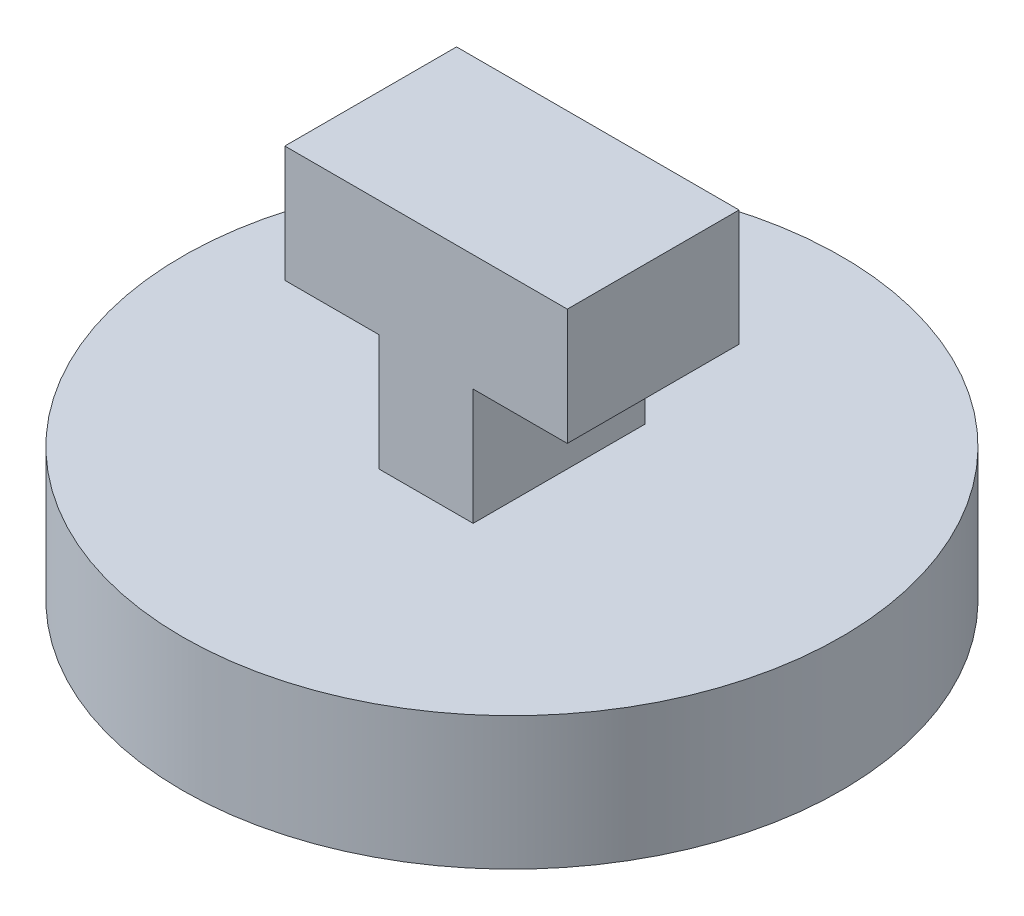
ISO-10303-21;
HEADER;
FILE_DESCRIPTION(('STEP AP214'),'2;1');
FILE_NAME('part.step','',(''),(''),'','','');
FILE_SCHEMA(('AUTOMOTIVE_DESIGN { 1 0 10303 214 1 1 1 1 }'));
ENDSEC;
DATA;
#1=APPLICATION_CONTEXT('core data for automotive mechanical design processes');
#2=APPLICATION_PROTOCOL_DEFINITION('international standard','automotive_design',2000,#1);
#3=PRODUCT_CONTEXT('',#1,'mechanical');
#4=PRODUCT('Part','Part','',(#3));
#5=PRODUCT_RELATED_PRODUCT_CATEGORY('part','',(#4));
#6=PRODUCT_DEFINITION_FORMATION('','',#4);
#7=PRODUCT_DEFINITION_CONTEXT('part definition',#1,'design');
#8=PRODUCT_DEFINITION('design','',#6,#7);
#9=PRODUCT_DEFINITION_SHAPE('','',#8);
#10=(LENGTH_UNIT() NAMED_UNIT(*) SI_UNIT(.MILLI.,.METRE.));
#11=(NAMED_UNIT(*) PLANE_ANGLE_UNIT() SI_UNIT($,.RADIAN.));
#12=(NAMED_UNIT(*) SI_UNIT($,.STERADIAN.) SOLID_ANGLE_UNIT());
#13=UNCERTAINTY_MEASURE_WITH_UNIT(LENGTH_MEASURE(1.E-05),#10,'distance_accuracy_value','');
#14=(GEOMETRIC_REPRESENTATION_CONTEXT(3) GLOBAL_UNCERTAINTY_ASSIGNED_CONTEXT((#13)) GLOBAL_UNIT_ASSIGNED_CONTEXT((#10,
#11,#12)) REPRESENTATION_CONTEXT('',''));
#15=CARTESIAN_POINT('',(0.,0.,0.));
#16=DIRECTION('',(0.,0.,1.));
#17=DIRECTION('',(1.,0.,0.));
#18=AXIS2_PLACEMENT_3D('',#15,#16,#17);
#19=CARTESIAN_POINT('',(0.,2.4,0.));
#20=DIRECTION('',(0.,1.,0.));
#21=DIRECTION('',(0.,0.,1.));
#22=AXIS2_PLACEMENT_3D('',#19,#20,#21);
#23=PLANE('',#22);
#24=CARTESIAN_POINT('',(0.,2.4,0.));
#25=DIRECTION('',(0.,1.,0.));
#26=DIRECTION('',(0.,0.,1.));
#27=AXIS2_PLACEMENT_3D('',#24,#25,#26);
#28=CIRCLE('',#27,5.95);
#29=CARTESIAN_POINT('',(0.,2.4,5.95));
#30=VERTEX_POINT('',#29);
#31=EDGE_CURVE('E11',#30,#30,#28,.T.);
#32=ORIENTED_EDGE('',*,*,#31,.T.);
#33=EDGE_LOOP('',(#32));
#34=FACE_BOUND('',#33,.T.);
#35=DIRECTION('',(1.,0.,0.));
#36=VECTOR('',#35,1.);
#37=CARTESIAN_POINT('',(-0.849999999999999,2.4,-1.55));
#38=LINE('',#37,#36);
#39=CARTESIAN_POINT('',(-0.849999999999999,2.4,-1.55));
#40=VERTEX_POINT('',#39);
#41=CARTESIAN_POINT('',(0.850000000000004,2.4,-1.55));
#42=VERTEX_POINT('',#41);
#43=EDGE_CURVE('E70',#40,#42,#38,.T.);
#44=ORIENTED_EDGE('',*,*,#43,.T.);
#45=DIRECTION('',(0.,0.,1.));
#46=VECTOR('',#45,1.);
#47=CARTESIAN_POINT('',(0.850000000000004,2.4,-1.55));
#48=LINE('',#47,#46);
#49=CARTESIAN_POINT('',(0.850000000000004,2.4,1.55));
#50=VERTEX_POINT('',#49);
#51=EDGE_CURVE('E119',#42,#50,#48,.T.);
#52=ORIENTED_EDGE('',*,*,#51,.T.);
#53=DIRECTION('',(1.,0.,0.));
#54=VECTOR('',#53,1.);
#55=CARTESIAN_POINT('',(-0.849999999999999,2.4,1.55));
#56=LINE('',#55,#54);
#57=CARTESIAN_POINT('',(-0.849999999999999,2.4,1.55));
#58=VERTEX_POINT('',#57);
#59=EDGE_CURVE('E126',#58,#50,#56,.T.);
#60=ORIENTED_EDGE('',*,*,#59,.F.);
#61=DIRECTION('',(0.,0.,1.));
#62=VECTOR('',#61,1.);
#63=CARTESIAN_POINT('',(-0.849999999999999,2.4,-1.55));
#64=LINE('',#63,#62);
#65=EDGE_CURVE('E163',#40,#58,#64,.T.);
#66=ORIENTED_EDGE('',*,*,#65,.F.);
#67=EDGE_LOOP('',(#44,#52,#60,#66));
#68=FACE_BOUND('',#67,.T.);
#69=ADVANCED_FACE('F49',(#34,#68),#23,.T.);
#70=CARTESIAN_POINT('',(0.,2.4,0.));
#71=DIRECTION('',(0.,-1.,0.));
#72=DIRECTION('',(0.,0.,-1.));
#73=AXIS2_PLACEMENT_3D('',#70,#71,#72);
#74=CYLINDRICAL_SURFACE('',#73,5.95);
#75=ORIENTED_EDGE('',*,*,#31,.F.);
#76=EDGE_LOOP('',(#75));
#77=FACE_BOUND('',#76,.T.);
#78=CARTESIAN_POINT('',(0.,0.,0.));
#79=DIRECTION('',(0.,1.,0.));
#80=DIRECTION('',(0.,0.,1.));
#81=AXIS2_PLACEMENT_3D('',#78,#79,#80);
#82=CIRCLE('',#81,5.95);
#83=CARTESIAN_POINT('',(0.,0.,5.95));
#84=VERTEX_POINT('',#83);
#85=EDGE_CURVE('E53',#84,#84,#82,.T.);
#86=ORIENTED_EDGE('',*,*,#85,.T.);
#87=EDGE_LOOP('',(#86));
#88=FACE_BOUND('',#87,.T.);
#89=ADVANCED_FACE('F51',(#77,#88),#74,.T.);
#90=CARTESIAN_POINT('',(0.,0.,0.));
#91=DIRECTION('',(0.,1.,0.));
#92=DIRECTION('',(0.,0.,1.));
#93=AXIS2_PLACEMENT_3D('',#90,#91,#92);
#94=PLANE('',#93);
#95=ORIENTED_EDGE('',*,*,#85,.F.);
#96=EDGE_LOOP('',(#95));
#97=FACE_BOUND('',#96,.T.);
#98=ADVANCED_FACE('F229',(#97),#94,.F.);
#99=CARTESIAN_POINT('',(-0.849999999999999,2.4,-1.55));
#100=DIRECTION('',(-1.,0.,0.));
#101=DIRECTION('',(0.,0.,1.));
#102=AXIS2_PLACEMENT_3D('',#99,#100,#101);
#103=PLANE('',#102);
#104=ORIENTED_EDGE('',*,*,#65,.T.);
#105=DIRECTION('',(0.,-1.,0.));
#106=VECTOR('',#105,1.);
#107=CARTESIAN_POINT('',(-0.849999999999999,2.4,1.55));
#108=LINE('',#107,#106);
#109=CARTESIAN_POINT('',(-0.849999999999999,4.5,1.55));
#110=VERTEX_POINT('',#109);
#111=EDGE_CURVE('E133',#110,#58,#108,.T.);
#112=ORIENTED_EDGE('',*,*,#111,.F.);
#113=DIRECTION('',(0.,0.,1.));
#114=VECTOR('',#113,1.);
#115=CARTESIAN_POINT('',(-0.849999999999999,4.5,-1.55));
#116=LINE('',#115,#114);
#117=CARTESIAN_POINT('',(-0.849999999999999,4.5,-1.55));
#118=VERTEX_POINT('',#117);
#119=EDGE_CURVE('E160',#118,#110,#116,.T.);
#120=ORIENTED_EDGE('',*,*,#119,.F.);
#121=DIRECTION('',(0.,-1.,0.));
#122=VECTOR('',#121,1.);
#123=CARTESIAN_POINT('',(-0.849999999999999,2.4,-1.55));
#124=LINE('',#123,#122);
#125=EDGE_CURVE('E139',#118,#40,#124,.T.);
#126=ORIENTED_EDGE('',*,*,#125,.T.);
#127=EDGE_LOOP('',(#104,#112,#120,#126));
#128=FACE_BOUND('',#127,.T.);
#129=ADVANCED_FACE('F227',(#128),#103,.T.);
#130=CARTESIAN_POINT('',(-0.849999999999999,4.5,-1.55));
#131=DIRECTION('',(0.,-1.,0.));
#132=DIRECTION('',(0.,0.,-1.));
#133=AXIS2_PLACEMENT_3D('',#130,#131,#132);
#134=PLANE('',#133);
#135=ORIENTED_EDGE('',*,*,#119,.T.);
#136=DIRECTION('',(1.,0.,0.));
#137=VECTOR('',#136,1.);
#138=CARTESIAN_POINT('',(-0.849999999999999,4.5,1.55));
#139=LINE('',#138,#137);
#140=CARTESIAN_POINT('',(-2.55,4.5,1.55));
#141=VERTEX_POINT('',#140);
#142=EDGE_CURVE('E191',#141,#110,#139,.T.);
#143=ORIENTED_EDGE('',*,*,#142,.F.);
#144=DIRECTION('',(0.,0.,1.));
#145=VECTOR('',#144,1.);
#146=CARTESIAN_POINT('',(-2.55,4.5,-1.55));
#147=LINE('',#146,#145);
#148=CARTESIAN_POINT('',(-2.55,4.5,-1.55));
#149=VERTEX_POINT('',#148);
#150=EDGE_CURVE('E157',#149,#141,#147,.T.);
#151=ORIENTED_EDGE('',*,*,#150,.F.);
#152=DIRECTION('',(1.,0.,0.));
#153=VECTOR('',#152,1.);
#154=CARTESIAN_POINT('',(-0.849999999999999,4.5,-1.55));
#155=LINE('',#154,#153);
#156=EDGE_CURVE('E146',#149,#118,#155,.T.);
#157=ORIENTED_EDGE('',*,*,#156,.T.);
#158=EDGE_LOOP('',(#135,#143,#151,#157));
#159=FACE_BOUND('',#158,.T.);
#160=ADVANCED_FACE('F225',(#159),#134,.T.);
#161=CARTESIAN_POINT('',(-2.55,4.5,-1.55));
#162=DIRECTION('',(-1.,0.,0.));
#163=DIRECTION('',(0.,0.,1.));
#164=AXIS2_PLACEMENT_3D('',#161,#162,#163);
#165=PLANE('',#164);
#166=ORIENTED_EDGE('',*,*,#150,.T.);
#167=DIRECTION('',(0.,-1.,0.));
#168=VECTOR('',#167,1.);
#169=CARTESIAN_POINT('',(-2.55,4.5,1.55));
#170=LINE('',#169,#168);
#171=CARTESIAN_POINT('',(-2.55,6.6,1.55));
#172=VERTEX_POINT('',#171);
#173=EDGE_CURVE('E194',#172,#141,#170,.T.);
#174=ORIENTED_EDGE('',*,*,#173,.F.);
#175=DIRECTION('',(0.,0.,1.));
#176=VECTOR('',#175,1.);
#177=CARTESIAN_POINT('',(-2.55,6.6,-1.55));
#178=LINE('',#177,#176);
#179=CARTESIAN_POINT('',(-2.55,6.6,-1.55));
#180=VERTEX_POINT('',#179);
#181=EDGE_CURVE('E154',#180,#172,#178,.T.);
#182=ORIENTED_EDGE('',*,*,#181,.F.);
#183=DIRECTION('',(0.,-1.,0.));
#184=VECTOR('',#183,1.);
#185=CARTESIAN_POINT('',(-2.55,4.5,-1.55));
#186=LINE('',#185,#184);
#187=EDGE_CURVE('E169',#180,#149,#186,.T.);
#188=ORIENTED_EDGE('',*,*,#187,.T.);
#189=EDGE_LOOP('',(#166,#174,#182,#188));
#190=FACE_BOUND('',#189,.T.);
#191=ADVANCED_FACE('F221',(#190),#165,.T.);
#192=CARTESIAN_POINT('',(-2.55,6.6,-1.55));
#193=DIRECTION('',(0.,1.,0.));
#194=DIRECTION('',(0.,0.,1.));
#195=AXIS2_PLACEMENT_3D('',#192,#193,#194);
#196=PLANE('',#195);
#197=ORIENTED_EDGE('',*,*,#181,.T.);
#198=DIRECTION('',(-1.,0.,0.));
#199=VECTOR('',#198,1.);
#200=CARTESIAN_POINT('',(-2.55,6.6,1.55));
#201=LINE('',#200,#199);
#202=CARTESIAN_POINT('',(2.55,6.6,1.55));
#203=VERTEX_POINT('',#202);
#204=EDGE_CURVE('E198',#203,#172,#201,.T.);
#205=ORIENTED_EDGE('',*,*,#204,.F.);
#206=DIRECTION('',(0.,0.,1.));
#207=VECTOR('',#206,1.);
#208=CARTESIAN_POINT('',(2.55,6.6,-1.55));
#209=LINE('',#208,#207);
#210=CARTESIAN_POINT('',(2.55,6.6,-1.55));
#211=VERTEX_POINT('',#210);
#212=EDGE_CURVE('E151',#211,#203,#209,.T.);
#213=ORIENTED_EDGE('',*,*,#212,.F.);
#214=DIRECTION('',(-1.,0.,0.));
#215=VECTOR('',#214,1.);
#216=CARTESIAN_POINT('',(-2.55,6.6,-1.55));
#217=LINE('',#216,#215);
#218=EDGE_CURVE('E173',#211,#180,#217,.T.);
#219=ORIENTED_EDGE('',*,*,#218,.T.);
#220=EDGE_LOOP('',(#197,#205,#213,#219));
#221=FACE_BOUND('',#220,.T.);
#222=ADVANCED_FACE('F216',(#221),#196,.T.);
#223=CARTESIAN_POINT('',(2.55,6.6,-1.55));
#224=DIRECTION('',(1.,0.,0.));
#225=DIRECTION('',(0.,1.,0.));
#226=AXIS2_PLACEMENT_3D('',#223,#224,#225);
#227=PLANE('',#226);
#228=ORIENTED_EDGE('',*,*,#212,.T.);
#229=DIRECTION('',(0.,1.,0.));
#230=VECTOR('',#229,1.);
#231=CARTESIAN_POINT('',(2.55,6.6,1.55));
#232=LINE('',#231,#230);
#233=CARTESIAN_POINT('',(2.55,4.5,1.55));
#234=VERTEX_POINT('',#233);
#235=EDGE_CURVE('E202',#234,#203,#232,.T.);
#236=ORIENTED_EDGE('',*,*,#235,.F.);
#237=DIRECTION('',(0.,0.,1.));
#238=VECTOR('',#237,1.);
#239=CARTESIAN_POINT('',(2.55,4.5,-1.55));
#240=LINE('',#239,#238);
#241=CARTESIAN_POINT('',(2.55,4.5,-1.55));
#242=VERTEX_POINT('',#241);
#243=EDGE_CURVE('E144',#242,#234,#240,.T.);
#244=ORIENTED_EDGE('',*,*,#243,.F.);
#245=DIRECTION('',(0.,1.,0.));
#246=VECTOR('',#245,1.);
#247=CARTESIAN_POINT('',(2.55,6.6,-1.55));
#248=LINE('',#247,#246);
#249=EDGE_CURVE('E177',#242,#211,#248,.T.);
#250=ORIENTED_EDGE('',*,*,#249,.T.);
#251=EDGE_LOOP('',(#228,#236,#244,#250));
#252=FACE_BOUND('',#251,.T.);
#253=ADVANCED_FACE('F212',(#252),#227,.T.);
#254=CARTESIAN_POINT('',(2.55,4.5,-1.55));
#255=DIRECTION('',(0.,-1.,0.));
#256=DIRECTION('',(1.,0.,0.));
#257=AXIS2_PLACEMENT_3D('',#254,#255,#256);
#258=PLANE('',#257);
#259=ORIENTED_EDGE('',*,*,#243,.T.);
#260=DIRECTION('',(1.,0.,0.));
#261=VECTOR('',#260,1.);
#262=CARTESIAN_POINT('',(2.55,4.5,1.55));
#263=LINE('',#262,#261);
#264=CARTESIAN_POINT('',(0.850000000000005,4.5,1.55));
#265=VERTEX_POINT('',#264);
#266=EDGE_CURVE('E125',#265,#234,#263,.T.);
#267=ORIENTED_EDGE('',*,*,#266,.F.);
#268=DIRECTION('',(0.,0.,1.));
#269=VECTOR('',#268,1.);
#270=CARTESIAN_POINT('',(0.850000000000005,4.5,-1.55));
#271=LINE('',#270,#269);
#272=CARTESIAN_POINT('',(0.850000000000005,4.5,-1.55));
#273=VERTEX_POINT('',#272);
#274=EDGE_CURVE('E120',#273,#265,#271,.T.);
#275=ORIENTED_EDGE('',*,*,#274,.F.);
#276=DIRECTION('',(1.,0.,0.));
#277=VECTOR('',#276,1.);
#278=CARTESIAN_POINT('',(2.55,4.5,-1.55));
#279=LINE('',#278,#277);
#280=EDGE_CURVE('E181',#273,#242,#279,.T.);
#281=ORIENTED_EDGE('',*,*,#280,.T.);
#282=EDGE_LOOP('',(#259,#267,#275,#281));
#283=FACE_BOUND('',#282,.T.);
#284=ADVANCED_FACE('F248',(#283),#258,.T.);
#285=CARTESIAN_POINT('',(0.850000000000005,4.5,-1.55));
#286=DIRECTION('',(1.,0.,0.));
#287=DIRECTION('',(0.,1.,0.));
#288=AXIS2_PLACEMENT_3D('',#285,#286,#287);
#289=PLANE('',#288);
#290=ORIENTED_EDGE('',*,*,#274,.T.);
#291=DIRECTION('',(0.,1.,0.));
#292=VECTOR('',#291,1.);
#293=CARTESIAN_POINT('',(0.850000000000005,4.5,1.55));
#294=LINE('',#293,#292);
#295=EDGE_CURVE('E115',#50,#265,#294,.T.);
#296=ORIENTED_EDGE('',*,*,#295,.F.);
#297=ORIENTED_EDGE('',*,*,#51,.F.);
#298=DIRECTION('',(0.,1.,0.));
#299=VECTOR('',#298,1.);
#300=CARTESIAN_POINT('',(0.850000000000005,4.5,-1.55));
#301=LINE('',#300,#299);
#302=EDGE_CURVE('E65',#42,#273,#301,.T.);
#303=ORIENTED_EDGE('',*,*,#302,.T.);
#304=EDGE_LOOP('',(#290,#296,#297,#303));
#305=FACE_BOUND('',#304,.T.);
#306=ADVANCED_FACE('F117',(#305),#289,.T.);
#307=CARTESIAN_POINT('',(0.,0.,-1.55));
#308=DIRECTION('',(0.,0.,-1.));
#309=DIRECTION('',(-1.,0.,0.));
#310=AXIS2_PLACEMENT_3D('',#307,#308,#309);
#311=PLANE('',#310);
#312=ORIENTED_EDGE('',*,*,#43,.F.);
#313=ORIENTED_EDGE('',*,*,#125,.F.);
#314=ORIENTED_EDGE('',*,*,#156,.F.);
#315=ORIENTED_EDGE('',*,*,#187,.F.);
#316=ORIENTED_EDGE('',*,*,#218,.F.);
#317=ORIENTED_EDGE('',*,*,#249,.F.);
#318=ORIENTED_EDGE('',*,*,#280,.F.);
#319=ORIENTED_EDGE('',*,*,#302,.F.);
#320=EDGE_LOOP('',(#312,#313,#314,#315,#316,#317,#318,#319));
#321=FACE_BOUND('',#320,.T.);
#322=ADVANCED_FACE('F218',(#321),#311,.T.);
#323=CARTESIAN_POINT('',(0.,0.,1.55));
#324=DIRECTION('',(0.,0.,-1.));
#325=DIRECTION('',(-1.,0.,0.));
#326=AXIS2_PLACEMENT_3D('',#323,#324,#325);
#327=PLANE('',#326);
#328=ORIENTED_EDGE('',*,*,#59,.T.);
#329=ORIENTED_EDGE('',*,*,#295,.T.);
#330=ORIENTED_EDGE('',*,*,#266,.T.);
#331=ORIENTED_EDGE('',*,*,#235,.T.);
#332=ORIENTED_EDGE('',*,*,#204,.T.);
#333=ORIENTED_EDGE('',*,*,#173,.T.);
#334=ORIENTED_EDGE('',*,*,#142,.T.);
#335=ORIENTED_EDGE('',*,*,#111,.T.);
#336=EDGE_LOOP('',(#328,#329,#330,#331,#332,#333,#334,#335));
#337=FACE_BOUND('',#336,.T.);
#338=ADVANCED_FACE('F130',(#337),#327,.F.);
#339=CLOSED_SHELL('',(#69,#89,#98,#129,#160,#191,#222,#253,#284,#306,#322,#338));
#340=MANIFOLD_SOLID_BREP('B2',#339);
#341=ADVANCED_BREP_SHAPE_REPRESENTATION('',(#18,#340),#14);
#342=SHAPE_DEFINITION_REPRESENTATION(#9,#341);
ENDSEC;
END-ISO-10303-21;
